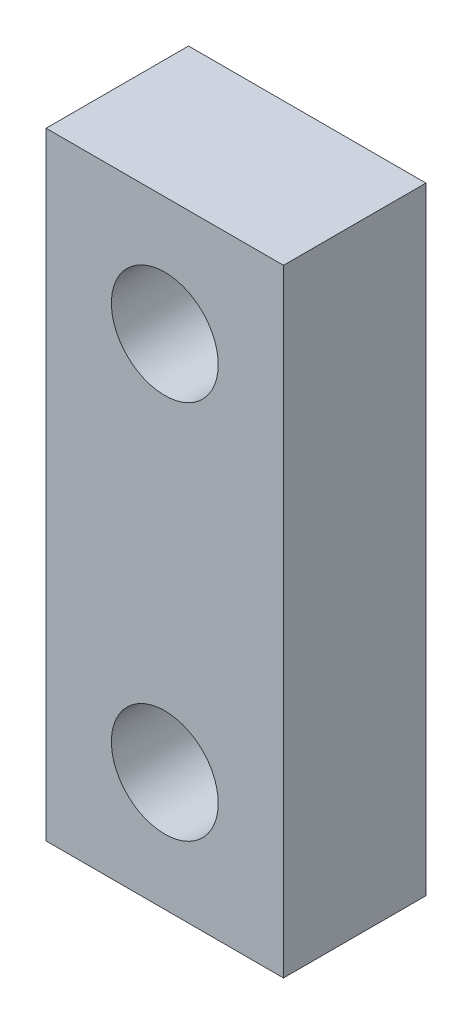
ISO-10303-21;
HEADER;
FILE_DESCRIPTION(('STEP AP214'),'2;1');
FILE_NAME('part.step','',(''),(''),'','','');
FILE_SCHEMA(('AUTOMOTIVE_DESIGN { 1 0 10303 214 1 1 1 1 }'));
ENDSEC;
DATA;
#1=APPLICATION_CONTEXT('core data for automotive mechanical design processes');
#2=APPLICATION_PROTOCOL_DEFINITION('international standard','automotive_design',2000,#1);
#3=PRODUCT_CONTEXT('',#1,'mechanical');
#4=PRODUCT('Part','Part','',(#3));
#5=PRODUCT_RELATED_PRODUCT_CATEGORY('part','',(#4));
#6=PRODUCT_DEFINITION_FORMATION('','',#4);
#7=PRODUCT_DEFINITION_CONTEXT('part definition',#1,'design');
#8=PRODUCT_DEFINITION('design','',#6,#7);
#9=PRODUCT_DEFINITION_SHAPE('','',#8);
#10=(LENGTH_UNIT() NAMED_UNIT(*) SI_UNIT(.MILLI.,.METRE.));
#11=(NAMED_UNIT(*) PLANE_ANGLE_UNIT() SI_UNIT($,.RADIAN.));
#12=(NAMED_UNIT(*) SI_UNIT($,.STERADIAN.) SOLID_ANGLE_UNIT());
#13=UNCERTAINTY_MEASURE_WITH_UNIT(LENGTH_MEASURE(1.E-05),#10,'distance_accuracy_value','');
#14=(GEOMETRIC_REPRESENTATION_CONTEXT(3) GLOBAL_UNCERTAINTY_ASSIGNED_CONTEXT((#13)) GLOBAL_UNIT_ASSIGNED_CONTEXT((#10,
#11,#12)) REPRESENTATION_CONTEXT('',''));
#15=CARTESIAN_POINT('',(0.,0.,0.));
#16=DIRECTION('',(0.,0.,1.));
#17=DIRECTION('',(1.,0.,0.));
#18=AXIS2_PLACEMENT_3D('',#15,#16,#17);
#19=CARTESIAN_POINT('',(-5.,13.,6.));
#20=DIRECTION('',(1.,0.,0.));
#21=DIRECTION('',(0.,1.,0.));
#22=AXIS2_PLACEMENT_3D('',#19,#20,#21);
#23=PLANE('',#22);
#24=DIRECTION('',(0.,-1.,0.));
#25=VECTOR('',#24,1.);
#26=CARTESIAN_POINT('',(-5.,13.,0.));
#27=LINE('',#26,#25);
#28=CARTESIAN_POINT('',(-5.,13.,0.));
#29=VERTEX_POINT('',#28);
#30=CARTESIAN_POINT('',(-5.,-13.,0.));
#31=VERTEX_POINT('',#30);
#32=EDGE_CURVE('E95',#29,#31,#27,.T.);
#33=ORIENTED_EDGE('',*,*,#32,.T.);
#34=DIRECTION('',(0.,0.,-1.));
#35=VECTOR('',#34,1.);
#36=CARTESIAN_POINT('',(-5.,-13.,6.));
#37=LINE('',#36,#35);
#38=CARTESIAN_POINT('',(-5.,-13.,6.));
#39=VERTEX_POINT('',#38);
#40=EDGE_CURVE('E11',#39,#31,#37,.T.);
#41=ORIENTED_EDGE('',*,*,#40,.F.);
#42=DIRECTION('',(0.,-1.,0.));
#43=VECTOR('',#42,1.);
#44=CARTESIAN_POINT('',(-5.,13.,6.));
#45=LINE('',#44,#43);
#46=CARTESIAN_POINT('',(-5.,13.,6.));
#47=VERTEX_POINT('',#46);
#48=EDGE_CURVE('E83',#47,#39,#45,.T.);
#49=ORIENTED_EDGE('',*,*,#48,.F.);
#50=DIRECTION('',(0.,0.,-1.));
#51=VECTOR('',#50,1.);
#52=CARTESIAN_POINT('',(-5.,13.,6.));
#53=LINE('',#52,#51);
#54=EDGE_CURVE('E91',#47,#29,#53,.T.);
#55=ORIENTED_EDGE('',*,*,#54,.T.);
#56=EDGE_LOOP('',(#33,#41,#49,#55));
#57=FACE_BOUND('',#56,.T.);
#58=ADVANCED_FACE('F32',(#57),#23,.F.);
#59=CARTESIAN_POINT('',(-5.,-13.,6.));
#60=DIRECTION('',(0.,1.,0.));
#61=DIRECTION('',(0.,0.,1.));
#62=AXIS2_PLACEMENT_3D('',#59,#60,#61);
#63=PLANE('',#62);
#64=DIRECTION('',(1.,0.,0.));
#65=VECTOR('',#64,1.);
#66=CARTESIAN_POINT('',(-5.,-13.,0.));
#67=LINE('',#66,#65);
#68=CARTESIAN_POINT('',(5.,-13.,0.));
#69=VERTEX_POINT('',#68);
#70=EDGE_CURVE('E87',#31,#69,#67,.T.);
#71=ORIENTED_EDGE('',*,*,#70,.T.);
#72=DIRECTION('',(0.,0.,-1.));
#73=VECTOR('',#72,1.);
#74=CARTESIAN_POINT('',(5.,-13.,6.));
#75=LINE('',#74,#73);
#76=CARTESIAN_POINT('',(5.,-13.,6.));
#77=VERTEX_POINT('',#76);
#78=EDGE_CURVE('E40',#77,#69,#75,.T.);
#79=ORIENTED_EDGE('',*,*,#78,.F.);
#80=DIRECTION('',(1.,0.,0.));
#81=VECTOR('',#80,1.);
#82=CARTESIAN_POINT('',(-5.,-13.,6.));
#83=LINE('',#82,#81);
#84=EDGE_CURVE('E78',#39,#77,#83,.T.);
#85=ORIENTED_EDGE('',*,*,#84,.F.);
#86=ORIENTED_EDGE('',*,*,#40,.T.);
#87=EDGE_LOOP('',(#71,#79,#85,#86));
#88=FACE_BOUND('',#87,.T.);
#89=ADVANCED_FACE('F86',(#88),#63,.F.);
#90=CARTESIAN_POINT('',(5.,13.,6.));
#91=DIRECTION('',(-1.,0.,0.));
#92=DIRECTION('',(0.,-1.,0.));
#93=AXIS2_PLACEMENT_3D('',#90,#91,#92);
#94=PLANE('',#93);
#95=DIRECTION('',(0.,1.,0.));
#96=VECTOR('',#95,1.);
#97=CARTESIAN_POINT('',(5.,13.,0.));
#98=LINE('',#97,#96);
#99=CARTESIAN_POINT('',(5.,13.,0.));
#100=VERTEX_POINT('',#99);
#101=EDGE_CURVE('E65',#69,#100,#98,.T.);
#102=ORIENTED_EDGE('',*,*,#101,.T.);
#103=DIRECTION('',(0.,0.,-1.));
#104=VECTOR('',#103,1.);
#105=CARTESIAN_POINT('',(5.,13.,6.));
#106=LINE('',#105,#104);
#107=CARTESIAN_POINT('',(5.,13.,6.));
#108=VERTEX_POINT('',#107);
#109=EDGE_CURVE('E88',#108,#100,#106,.T.);
#110=ORIENTED_EDGE('',*,*,#109,.F.);
#111=DIRECTION('',(0.,1.,0.));
#112=VECTOR('',#111,1.);
#113=CARTESIAN_POINT('',(5.,13.,6.));
#114=LINE('',#113,#112);
#115=EDGE_CURVE('E81',#77,#108,#114,.T.);
#116=ORIENTED_EDGE('',*,*,#115,.F.);
#117=ORIENTED_EDGE('',*,*,#78,.T.);
#118=EDGE_LOOP('',(#102,#110,#116,#117));
#119=FACE_BOUND('',#118,.T.);
#120=ADVANCED_FACE('F89',(#119),#94,.F.);
#121=CARTESIAN_POINT('',(-5.,13.,6.));
#122=DIRECTION('',(0.,-1.,0.));
#123=DIRECTION('',(0.,0.,-1.));
#124=AXIS2_PLACEMENT_3D('',#121,#122,#123);
#125=PLANE('',#124);
#126=DIRECTION('',(-1.,0.,0.));
#127=VECTOR('',#126,1.);
#128=CARTESIAN_POINT('',(-5.,13.,0.));
#129=LINE('',#128,#127);
#130=EDGE_CURVE('E71',#100,#29,#129,.T.);
#131=ORIENTED_EDGE('',*,*,#130,.T.);
#132=ORIENTED_EDGE('',*,*,#54,.F.);
#133=DIRECTION('',(-1.,0.,0.));
#134=VECTOR('',#133,1.);
#135=CARTESIAN_POINT('',(-5.,13.,6.));
#136=LINE('',#135,#134);
#137=EDGE_CURVE('E48',#108,#47,#136,.T.);
#138=ORIENTED_EDGE('',*,*,#137,.F.);
#139=ORIENTED_EDGE('',*,*,#109,.T.);
#140=EDGE_LOOP('',(#131,#132,#138,#139));
#141=FACE_BOUND('',#140,.T.);
#142=ADVANCED_FACE('F103',(#141),#125,.F.);
#143=CARTESIAN_POINT('',(0.,0.,6.));
#144=DIRECTION('',(0.,0.,1.));
#145=DIRECTION('',(1.,0.,0.));
#146=AXIS2_PLACEMENT_3D('',#143,#144,#145);
#147=PLANE('',#146);
#148=CARTESIAN_POINT('',(0.,-8.,6.));
#149=DIRECTION('',(0.,0.,1.));
#150=DIRECTION('',(1.,0.,0.));
#151=AXIS2_PLACEMENT_3D('',#148,#149,#150);
#152=CIRCLE('',#151,2.25);
#153=CARTESIAN_POINT('',(2.25,-8.,6.));
#154=VERTEX_POINT('',#153);
#155=EDGE_CURVE('E115',#154,#154,#152,.T.);
#156=ORIENTED_EDGE('',*,*,#155,.F.);
#157=EDGE_LOOP('',(#156));
#158=FACE_BOUND('',#157,.T.);
#159=CARTESIAN_POINT('',(0.,8.,6.));
#160=DIRECTION('',(0.,0.,1.));
#161=DIRECTION('',(1.,0.,0.));
#162=AXIS2_PLACEMENT_3D('',#159,#160,#161);
#163=CIRCLE('',#162,2.25);
#164=CARTESIAN_POINT('',(2.25,8.,6.));
#165=VERTEX_POINT('',#164);
#166=EDGE_CURVE('E109',#165,#165,#163,.T.);
#167=ORIENTED_EDGE('',*,*,#166,.F.);
#168=EDGE_LOOP('',(#167));
#169=FACE_BOUND('',#168,.T.);
#170=ORIENTED_EDGE('',*,*,#48,.T.);
#171=ORIENTED_EDGE('',*,*,#84,.T.);
#172=ORIENTED_EDGE('',*,*,#115,.T.);
#173=ORIENTED_EDGE('',*,*,#137,.T.);
#174=EDGE_LOOP('',(#170,#171,#172,#173));
#175=FACE_BOUND('',#174,.T.);
#176=ADVANCED_FACE('F79',(#158,#169,#175),#147,.T.);
#177=CARTESIAN_POINT('',(0.,0.,0.));
#178=DIRECTION('',(0.,0.,1.));
#179=DIRECTION('',(1.,0.,0.));
#180=AXIS2_PLACEMENT_3D('',#177,#178,#179);
#181=PLANE('',#180);
#182=CARTESIAN_POINT('',(0.,-8.,0.));
#183=DIRECTION('',(0.,0.,1.));
#184=DIRECTION('',(1.,0.,0.));
#185=AXIS2_PLACEMENT_3D('',#182,#183,#184);
#186=CIRCLE('',#185,2.25);
#187=CARTESIAN_POINT('',(2.25,-8.,0.));
#188=VERTEX_POINT('',#187);
#189=EDGE_CURVE('E112',#188,#188,#186,.T.);
#190=ORIENTED_EDGE('',*,*,#189,.T.);
#191=EDGE_LOOP('',(#190));
#192=FACE_BOUND('',#191,.T.);
#193=CARTESIAN_POINT('',(0.,8.,0.));
#194=DIRECTION('',(0.,0.,1.));
#195=DIRECTION('',(1.,0.,0.));
#196=AXIS2_PLACEMENT_3D('',#193,#194,#195);
#197=CIRCLE('',#196,2.25);
#198=CARTESIAN_POINT('',(2.25,8.,0.));
#199=VERTEX_POINT('',#198);
#200=EDGE_CURVE('E98',#199,#199,#197,.T.);
#201=ORIENTED_EDGE('',*,*,#200,.T.);
#202=EDGE_LOOP('',(#201));
#203=FACE_BOUND('',#202,.T.);
#204=ORIENTED_EDGE('',*,*,#32,.F.);
#205=ORIENTED_EDGE('',*,*,#130,.F.);
#206=ORIENTED_EDGE('',*,*,#101,.F.);
#207=ORIENTED_EDGE('',*,*,#70,.F.);
#208=EDGE_LOOP('',(#204,#205,#206,#207));
#209=FACE_BOUND('',#208,.T.);
#210=ADVANCED_FACE('F106',(#192,#203,#209),#181,.F.);
#211=CARTESIAN_POINT('',(0.,8.,0.));
#212=DIRECTION('',(0.,0.,1.));
#213=DIRECTION('',(1.,0.,0.));
#214=AXIS2_PLACEMENT_3D('',#211,#212,#213);
#215=CYLINDRICAL_SURFACE('',#214,2.25);
#216=ORIENTED_EDGE('',*,*,#200,.F.);
#217=EDGE_LOOP('',(#216));
#218=FACE_BOUND('',#217,.T.);
#219=ORIENTED_EDGE('',*,*,#166,.T.);
#220=EDGE_LOOP('',(#219));
#221=FACE_BOUND('',#220,.T.);
#222=ADVANCED_FACE('F126',(#218,#221),#215,.F.);
#223=CARTESIAN_POINT('',(0.,-8.,0.));
#224=DIRECTION('',(0.,0.,1.));
#225=DIRECTION('',(1.,0.,0.));
#226=AXIS2_PLACEMENT_3D('',#223,#224,#225);
#227=CYLINDRICAL_SURFACE('',#226,2.25);
#228=ORIENTED_EDGE('',*,*,#189,.F.);
#229=EDGE_LOOP('',(#228));
#230=FACE_BOUND('',#229,.T.);
#231=ORIENTED_EDGE('',*,*,#155,.T.);
#232=EDGE_LOOP('',(#231));
#233=FACE_BOUND('',#232,.T.);
#234=ADVANCED_FACE('F123',(#230,#233),#227,.F.);
#235=CLOSED_SHELL('',(#58,#89,#120,#142,#176,#210,#222,#234));
#236=MANIFOLD_SOLID_BREP('B2',#235);
#237=ADVANCED_BREP_SHAPE_REPRESENTATION('',(#18,#236),#14);
#238=SHAPE_DEFINITION_REPRESENTATION(#9,#237);
ENDSEC;
END-ISO-10303-21;
